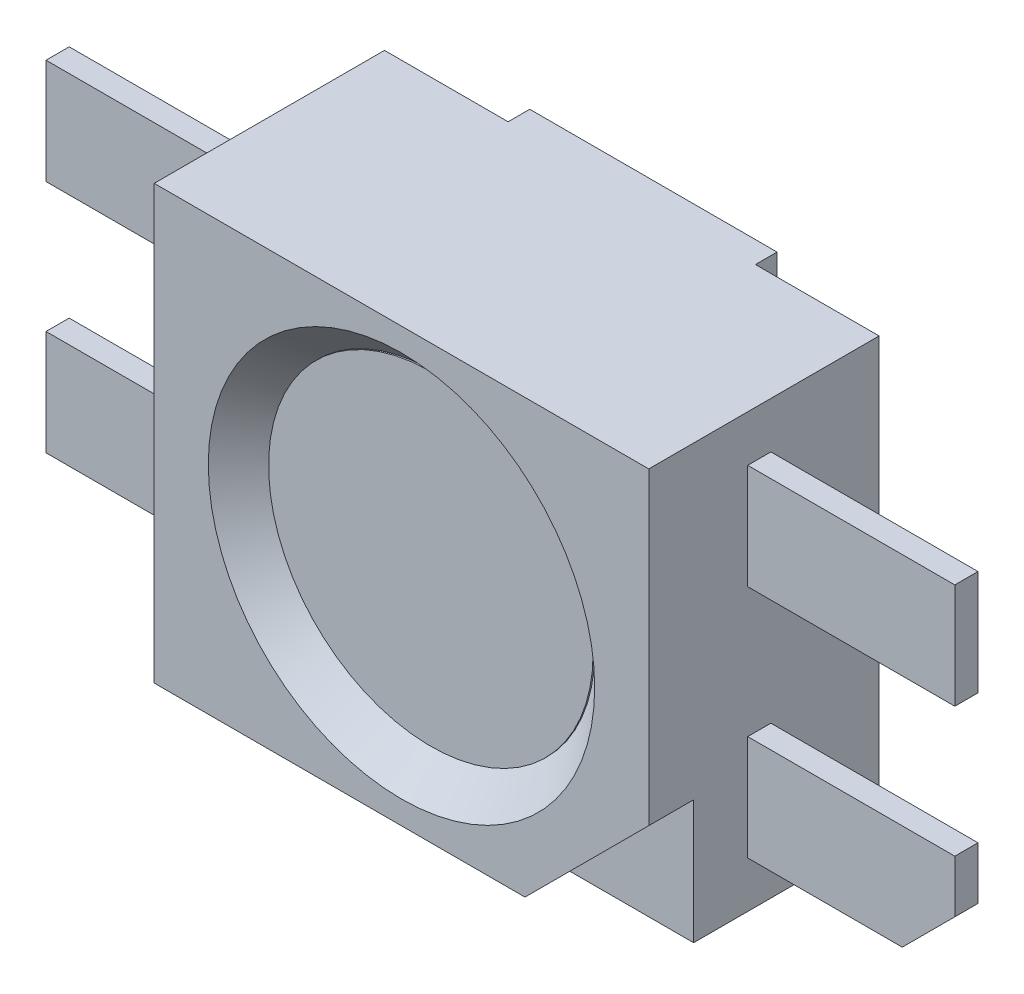
ISO-10303-21;
HEADER;
FILE_DESCRIPTION(('STEP AP214'),'2;1');
FILE_NAME('part.step','',(''),(''),'','','');
FILE_SCHEMA(('AUTOMOTIVE_DESIGN { 1 0 10303 214 1 1 1 1 }'));
ENDSEC;
DATA;
#1=APPLICATION_CONTEXT('core data for automotive mechanical design processes');
#2=APPLICATION_PROTOCOL_DEFINITION('international standard','automotive_design',2000,#1);
#3=PRODUCT_CONTEXT('',#1,'mechanical');
#4=PRODUCT('Part','Part','',(#3));
#5=PRODUCT_RELATED_PRODUCT_CATEGORY('part','',(#4));
#6=PRODUCT_DEFINITION_FORMATION('','',#4);
#7=PRODUCT_DEFINITION_CONTEXT('part definition',#1,'design');
#8=PRODUCT_DEFINITION('design','',#6,#7);
#9=PRODUCT_DEFINITION_SHAPE('','',#8);
#10=(LENGTH_UNIT() NAMED_UNIT(*) SI_UNIT(.MILLI.,.METRE.));
#11=(NAMED_UNIT(*) PLANE_ANGLE_UNIT() SI_UNIT($,.RADIAN.));
#12=(NAMED_UNIT(*) SI_UNIT($,.STERADIAN.) SOLID_ANGLE_UNIT());
#13=UNCERTAINTY_MEASURE_WITH_UNIT(LENGTH_MEASURE(1.E-05),#10,'distance_accuracy_value','');
#14=(GEOMETRIC_REPRESENTATION_CONTEXT(3) GLOBAL_UNCERTAINTY_ASSIGNED_CONTEXT((#13)) GLOBAL_UNIT_ASSIGNED_CONTEXT((#10,
#11,#12)) REPRESENTATION_CONTEXT('',''));
#15=CARTESIAN_POINT('',(0.,0.,0.));
#16=DIRECTION('',(0.,0.,1.));
#17=DIRECTION('',(1.,0.,0.));
#18=AXIS2_PLACEMENT_3D('',#15,#16,#17);
#19=CARTESIAN_POINT('',(-2.27,0.76,0.));
#20=DIRECTION('',(0.,0.,1.));
#21=DIRECTION('',(1.,0.,0.));
#22=AXIS2_PLACEMENT_3D('',#19,#20,#21);
#23=PLANE('',#22);
#24=DIRECTION('',(1.,0.,0.));
#25=VECTOR('',#24,1.);
#26=CARTESIAN_POINT('',(-2.94,0.42,0.));
#27=LINE('',#26,#25);
#28=CARTESIAN_POINT('',(-2.94,0.42,0.));
#29=VERTEX_POINT('',#28);
#30=CARTESIAN_POINT('',(-1.6,0.42,0.));
#31=VERTEX_POINT('',#30);
#32=EDGE_CURVE('P0_E79',#29,#31,#27,.T.);
#33=ORIENTED_EDGE('',*,*,#32,.F.);
#34=DIRECTION('',(0.,1.,0.));
#35=VECTOR('',#34,1.);
#36=CARTESIAN_POINT('',(-2.94,1.1,0.));
#37=LINE('',#36,#35);
#38=CARTESIAN_POINT('',(-2.94,1.1,0.));
#39=VERTEX_POINT('',#38);
#40=EDGE_CURVE('P0_E55',#39,#29,#37,.F.);
#41=ORIENTED_EDGE('',*,*,#40,.F.);
#42=DIRECTION('',(1.,0.,0.));
#43=VECTOR('',#42,1.);
#44=CARTESIAN_POINT('',(-1.6,1.1,0.));
#45=LINE('',#44,#43);
#46=CARTESIAN_POINT('',(-1.6,1.1,0.));
#47=VERTEX_POINT('',#46);
#48=EDGE_CURVE('P0_E57',#47,#39,#45,.F.);
#49=ORIENTED_EDGE('',*,*,#48,.F.);
#50=DIRECTION('',(0.,1.,0.));
#51=VECTOR('',#50,1.);
#52=CARTESIAN_POINT('',(-1.6,0.42,0.));
#53=LINE('',#52,#51);
#54=EDGE_CURVE('P0_E20',#31,#47,#53,.T.);
#55=ORIENTED_EDGE('',*,*,#54,.F.);
#56=EDGE_LOOP('',(#33,#41,#49,#55));
#57=FACE_BOUND('',#56,.T.);
#58=ADVANCED_FACE('P0_F17',(#57),#23,.F.);
#59=CARTESIAN_POINT('',(-1.6,0.42,0.));
#60=DIRECTION('',(1.,0.,0.));
#61=DIRECTION('',(0.,0.,-1.));
#62=AXIS2_PLACEMENT_3D('',#59,#60,#61);
#63=PLANE('',#62);
#64=DIRECTION('',(0.,1.,0.));
#65=VECTOR('',#64,1.);
#66=CARTESIAN_POINT('',(-1.6,0.76,0.15));
#67=LINE('',#66,#65);
#68=CARTESIAN_POINT('',(-1.6,0.42,0.15));
#69=VERTEX_POINT('',#68);
#70=CARTESIAN_POINT('',(-1.6,1.1,0.15));
#71=VERTEX_POINT('',#70);
#72=EDGE_CURVE('P0_E83',#69,#71,#67,.T.);
#73=ORIENTED_EDGE('',*,*,#72,.F.);
#74=DIRECTION('',(0.,0.,-1.));
#75=VECTOR('',#74,1.);
#76=CARTESIAN_POINT('',(-1.6,0.42,0.));
#77=LINE('',#76,#75);
#78=EDGE_CURVE('P0_E68',#31,#69,#77,.F.);
#79=ORIENTED_EDGE('',*,*,#78,.F.);
#80=ORIENTED_EDGE('',*,*,#54,.T.);
#81=DIRECTION('',(0.,0.,1.));
#82=VECTOR('',#81,1.);
#83=CARTESIAN_POINT('',(-1.6,1.1,0.));
#84=LINE('',#83,#82);
#85=EDGE_CURVE('P0_E63',#71,#47,#84,.F.);
#86=ORIENTED_EDGE('',*,*,#85,.F.);
#87=EDGE_LOOP('',(#73,#79,#80,#86));
#88=FACE_BOUND('',#87,.T.);
#89=ADVANCED_FACE('P0_F65',(#88),#63,.T.);
#90=CARTESIAN_POINT('',(-1.6,1.1,0.));
#91=DIRECTION('',(0.,1.,0.));
#92=DIRECTION('',(0.,0.,1.));
#93=AXIS2_PLACEMENT_3D('',#90,#91,#92);
#94=PLANE('',#93);
#95=DIRECTION('',(1.,0.,0.));
#96=VECTOR('',#95,1.);
#97=CARTESIAN_POINT('',(-2.27,1.1,0.15));
#98=LINE('',#97,#96);
#99=CARTESIAN_POINT('',(-2.94,1.1,0.15));
#100=VERTEX_POINT('',#99);
#101=EDGE_CURVE('P0_E72',#71,#100,#98,.F.);
#102=ORIENTED_EDGE('',*,*,#101,.F.);
#103=ORIENTED_EDGE('',*,*,#85,.T.);
#104=ORIENTED_EDGE('',*,*,#48,.T.);
#105=DIRECTION('',(0.,0.,1.));
#106=VECTOR('',#105,1.);
#107=CARTESIAN_POINT('',(-2.94,1.1,0.));
#108=LINE('',#107,#106);
#109=EDGE_CURVE('P0_E75',#100,#39,#108,.F.);
#110=ORIENTED_EDGE('',*,*,#109,.F.);
#111=EDGE_LOOP('',(#102,#103,#104,#110));
#112=FACE_BOUND('',#111,.T.);
#113=ADVANCED_FACE('P0_F70',(#112),#94,.T.);
#114=CARTESIAN_POINT('',(-2.94,1.1,0.));
#115=DIRECTION('',(-1.,0.,0.));
#116=DIRECTION('',(0.,0.,1.));
#117=AXIS2_PLACEMENT_3D('',#114,#115,#116);
#118=PLANE('',#117);
#119=DIRECTION('',(0.,1.,0.));
#120=VECTOR('',#119,1.);
#121=CARTESIAN_POINT('',(-2.94,0.76,0.15));
#122=LINE('',#121,#120);
#123=CARTESIAN_POINT('',(-2.94,0.42,0.15));
#124=VERTEX_POINT('',#123);
#125=EDGE_CURVE('P0_E26',#100,#124,#122,.F.);
#126=ORIENTED_EDGE('',*,*,#125,.F.);
#127=ORIENTED_EDGE('',*,*,#109,.T.);
#128=ORIENTED_EDGE('',*,*,#40,.T.);
#129=DIRECTION('',(0.,0.,-1.));
#130=VECTOR('',#129,1.);
#131=CARTESIAN_POINT('',(-2.94,0.42,0.));
#132=LINE('',#131,#130);
#133=EDGE_CURVE('P0_E35',#124,#29,#132,.T.);
#134=ORIENTED_EDGE('',*,*,#133,.F.);
#135=EDGE_LOOP('',(#126,#127,#128,#134));
#136=FACE_BOUND('',#135,.T.);
#137=ADVANCED_FACE('P0_F89',(#136),#118,.T.);
#138=CARTESIAN_POINT('',(-2.94,0.42,0.));
#139=DIRECTION('',(0.,-1.,0.));
#140=DIRECTION('',(0.,0.,-1.));
#141=AXIS2_PLACEMENT_3D('',#138,#139,#140);
#142=PLANE('',#141);
#143=DIRECTION('',(1.,0.,0.));
#144=VECTOR('',#143,1.);
#145=CARTESIAN_POINT('',(-2.27,0.42,0.15));
#146=LINE('',#145,#144);
#147=EDGE_CURVE('P0_E11',#124,#69,#146,.T.);
#148=ORIENTED_EDGE('',*,*,#147,.F.);
#149=ORIENTED_EDGE('',*,*,#133,.T.);
#150=ORIENTED_EDGE('',*,*,#32,.T.);
#151=ORIENTED_EDGE('',*,*,#78,.T.);
#152=EDGE_LOOP('',(#148,#149,#150,#151));
#153=FACE_BOUND('',#152,.T.);
#154=ADVANCED_FACE('P0_F91',(#153),#142,.T.);
#155=CARTESIAN_POINT('',(-2.27,0.76,0.15));
#156=DIRECTION('',(0.,0.,1.));
#157=DIRECTION('',(1.,0.,0.));
#158=AXIS2_PLACEMENT_3D('',#155,#156,#157);
#159=PLANE('',#158);
#160=ORIENTED_EDGE('',*,*,#125,.T.);
#161=ORIENTED_EDGE('',*,*,#147,.T.);
#162=ORIENTED_EDGE('',*,*,#72,.T.);
#163=ORIENTED_EDGE('',*,*,#101,.T.);
#164=EDGE_LOOP('',(#160,#161,#162,#163));
#165=FACE_BOUND('',#164,.T.);
#166=ADVANCED_FACE('P0_F88',(#165),#159,.T.);
#167=CLOSED_SHELL('',(#58,#89,#113,#137,#154,#166));
#168=MANIFOLD_SOLID_BREP('P0_B1',#167);
#169=CARTESIAN_POINT('',(-2.27,-0.76,0.));
#170=DIRECTION('',(0.,0.,1.));
#171=DIRECTION('',(1.,0.,0.));
#172=AXIS2_PLACEMENT_3D('',#169,#170,#171);
#173=PLANE('',#172);
#174=DIRECTION('',(1.,0.,0.));
#175=VECTOR('',#174,1.);
#176=CARTESIAN_POINT('',(-2.94,-1.1,0.));
#177=LINE('',#176,#175);
#178=CARTESIAN_POINT('',(-2.94,-1.1,0.));
#179=VERTEX_POINT('',#178);
#180=CARTESIAN_POINT('',(-1.6,-1.1,0.));
#181=VERTEX_POINT('',#180);
#182=EDGE_CURVE('P1_E79',#179,#181,#177,.T.);
#183=ORIENTED_EDGE('',*,*,#182,.F.);
#184=DIRECTION('',(0.,1.,0.));
#185=VECTOR('',#184,1.);
#186=CARTESIAN_POINT('',(-2.94,-0.42,0.));
#187=LINE('',#186,#185);
#188=CARTESIAN_POINT('',(-2.94,-0.42,0.));
#189=VERTEX_POINT('',#188);
#190=EDGE_CURVE('P1_E55',#189,#179,#187,.F.);
#191=ORIENTED_EDGE('',*,*,#190,.F.);
#192=DIRECTION('',(1.,0.,0.));
#193=VECTOR('',#192,1.);
#194=CARTESIAN_POINT('',(-1.6,-0.42,0.));
#195=LINE('',#194,#193);
#196=CARTESIAN_POINT('',(-1.6,-0.42,0.));
#197=VERTEX_POINT('',#196);
#198=EDGE_CURVE('P1_E57',#197,#189,#195,.F.);
#199=ORIENTED_EDGE('',*,*,#198,.F.);
#200=DIRECTION('',(0.,1.,0.));
#201=VECTOR('',#200,1.);
#202=CARTESIAN_POINT('',(-1.6,-1.1,0.));
#203=LINE('',#202,#201);
#204=EDGE_CURVE('P1_E20',#181,#197,#203,.T.);
#205=ORIENTED_EDGE('',*,*,#204,.F.);
#206=EDGE_LOOP('',(#183,#191,#199,#205));
#207=FACE_BOUND('',#206,.T.);
#208=ADVANCED_FACE('P1_F17',(#207),#173,.F.);
#209=CARTESIAN_POINT('',(-1.6,-1.1,0.));
#210=DIRECTION('',(1.,0.,0.));
#211=DIRECTION('',(0.,0.,-1.));
#212=AXIS2_PLACEMENT_3D('',#209,#210,#211);
#213=PLANE('',#212);
#214=DIRECTION('',(0.,1.,0.));
#215=VECTOR('',#214,1.);
#216=CARTESIAN_POINT('',(-1.6,-0.76,0.15));
#217=LINE('',#216,#215);
#218=CARTESIAN_POINT('',(-1.6,-1.1,0.15));
#219=VERTEX_POINT('',#218);
#220=CARTESIAN_POINT('',(-1.6,-0.42,0.15));
#221=VERTEX_POINT('',#220);
#222=EDGE_CURVE('P1_E83',#219,#221,#217,.T.);
#223=ORIENTED_EDGE('',*,*,#222,.F.);
#224=DIRECTION('',(0.,0.,-1.));
#225=VECTOR('',#224,1.);
#226=CARTESIAN_POINT('',(-1.6,-1.1,0.));
#227=LINE('',#226,#225);
#228=EDGE_CURVE('P1_E68',#181,#219,#227,.F.);
#229=ORIENTED_EDGE('',*,*,#228,.F.);
#230=ORIENTED_EDGE('',*,*,#204,.T.);
#231=DIRECTION('',(0.,0.,1.));
#232=VECTOR('',#231,1.);
#233=CARTESIAN_POINT('',(-1.6,-0.42,0.));
#234=LINE('',#233,#232);
#235=EDGE_CURVE('P1_E63',#221,#197,#234,.F.);
#236=ORIENTED_EDGE('',*,*,#235,.F.);
#237=EDGE_LOOP('',(#223,#229,#230,#236));
#238=FACE_BOUND('',#237,.T.);
#239=ADVANCED_FACE('P1_F65',(#238),#213,.T.);
#240=CARTESIAN_POINT('',(-1.6,-0.42,0.));
#241=DIRECTION('',(0.,1.,0.));
#242=DIRECTION('',(0.,0.,1.));
#243=AXIS2_PLACEMENT_3D('',#240,#241,#242);
#244=PLANE('',#243);
#245=DIRECTION('',(1.,0.,0.));
#246=VECTOR('',#245,1.);
#247=CARTESIAN_POINT('',(-2.27,-0.42,0.15));
#248=LINE('',#247,#246);
#249=CARTESIAN_POINT('',(-2.94,-0.42,0.15));
#250=VERTEX_POINT('',#249);
#251=EDGE_CURVE('P1_E72',#221,#250,#248,.F.);
#252=ORIENTED_EDGE('',*,*,#251,.F.);
#253=ORIENTED_EDGE('',*,*,#235,.T.);
#254=ORIENTED_EDGE('',*,*,#198,.T.);
#255=DIRECTION('',(0.,0.,1.));
#256=VECTOR('',#255,1.);
#257=CARTESIAN_POINT('',(-2.94,-0.42,0.));
#258=LINE('',#257,#256);
#259=EDGE_CURVE('P1_E75',#250,#189,#258,.F.);
#260=ORIENTED_EDGE('',*,*,#259,.F.);
#261=EDGE_LOOP('',(#252,#253,#254,#260));
#262=FACE_BOUND('',#261,.T.);
#263=ADVANCED_FACE('P1_F70',(#262),#244,.T.);
#264=CARTESIAN_POINT('',(-2.94,-0.42,0.));
#265=DIRECTION('',(-1.,0.,0.));
#266=DIRECTION('',(0.,0.,1.));
#267=AXIS2_PLACEMENT_3D('',#264,#265,#266);
#268=PLANE('',#267);
#269=DIRECTION('',(0.,1.,0.));
#270=VECTOR('',#269,1.);
#271=CARTESIAN_POINT('',(-2.94,-0.76,0.15));
#272=LINE('',#271,#270);
#273=CARTESIAN_POINT('',(-2.94,-1.1,0.15));
#274=VERTEX_POINT('',#273);
#275=EDGE_CURVE('P1_E26',#250,#274,#272,.F.);
#276=ORIENTED_EDGE('',*,*,#275,.F.);
#277=ORIENTED_EDGE('',*,*,#259,.T.);
#278=ORIENTED_EDGE('',*,*,#190,.T.);
#279=DIRECTION('',(0.,0.,-1.));
#280=VECTOR('',#279,1.);
#281=CARTESIAN_POINT('',(-2.94,-1.1,0.));
#282=LINE('',#281,#280);
#283=EDGE_CURVE('P1_E35',#274,#179,#282,.T.);
#284=ORIENTED_EDGE('',*,*,#283,.F.);
#285=EDGE_LOOP('',(#276,#277,#278,#284));
#286=FACE_BOUND('',#285,.T.);
#287=ADVANCED_FACE('P1_F89',(#286),#268,.T.);
#288=CARTESIAN_POINT('',(-2.94,-1.1,0.));
#289=DIRECTION('',(0.,-1.,0.));
#290=DIRECTION('',(0.,0.,-1.));
#291=AXIS2_PLACEMENT_3D('',#288,#289,#290);
#292=PLANE('',#291);
#293=DIRECTION('',(1.,0.,0.));
#294=VECTOR('',#293,1.);
#295=CARTESIAN_POINT('',(-2.27,-1.1,0.15));
#296=LINE('',#295,#294);
#297=EDGE_CURVE('P1_E11',#274,#219,#296,.T.);
#298=ORIENTED_EDGE('',*,*,#297,.F.);
#299=ORIENTED_EDGE('',*,*,#283,.T.);
#300=ORIENTED_EDGE('',*,*,#182,.T.);
#301=ORIENTED_EDGE('',*,*,#228,.T.);
#302=EDGE_LOOP('',(#298,#299,#300,#301));
#303=FACE_BOUND('',#302,.T.);
#304=ADVANCED_FACE('P1_F91',(#303),#292,.T.);
#305=CARTESIAN_POINT('',(-2.27,-0.76,0.15));
#306=DIRECTION('',(0.,0.,1.));
#307=DIRECTION('',(1.,0.,0.));
#308=AXIS2_PLACEMENT_3D('',#305,#306,#307);
#309=PLANE('',#308);
#310=ORIENTED_EDGE('',*,*,#275,.T.);
#311=ORIENTED_EDGE('',*,*,#297,.T.);
#312=ORIENTED_EDGE('',*,*,#222,.T.);
#313=ORIENTED_EDGE('',*,*,#251,.T.);
#314=EDGE_LOOP('',(#310,#311,#312,#313));
#315=FACE_BOUND('',#314,.T.);
#316=ADVANCED_FACE('P1_F88',(#315),#309,.T.);
#317=CLOSED_SHELL('',(#208,#239,#263,#287,#304,#316));
#318=MANIFOLD_SOLID_BREP('P1_B1',#317);
#319=CARTESIAN_POINT('',(0.,0.,-0.7));
#320=DIRECTION('',(0.,0.,1.));
#321=DIRECTION('',(1.,0.,0.));
#322=AXIS2_PLACEMENT_3D('',#319,#320,#321);
#323=PLANE('',#322);
#324=CARTESIAN_POINT('',(0.,0.,-0.7));
#325=DIRECTION('',(0.,0.,-1.));
#326=DIRECTION('',(-1.,0.,0.));
#327=AXIS2_PLACEMENT_3D('',#324,#325,#326);
#328=CIRCLE('',#327,0.625);
#329=CARTESIAN_POINT('',(-0.625,0.,-0.7));
#330=VERTEX_POINT('',#329);
#331=EDGE_CURVE('P2_E20',#330,#330,#328,.T.);
#332=ORIENTED_EDGE('',*,*,#331,.T.);
#333=EDGE_LOOP('',(#332));
#334=FACE_BOUND('',#333,.T.);
#335=ADVANCED_FACE('P2_F17',(#334),#323,.F.);
#336=CARTESIAN_POINT('',(0.,0.,-0.7));
#337=DIRECTION('',(0.,0.,-1.));
#338=DIRECTION('',(-1.,0.,0.));
#339=AXIS2_PLACEMENT_3D('',#336,#337,#338);
#340=CYLINDRICAL_SURFACE('',#339,0.625);
#341=CARTESIAN_POINT('',(0.,0.,-0.84));
#342=DIRECTION('',(0.,0.,-1.));
#343=DIRECTION('',(-1.,0.,0.));
#344=AXIS2_PLACEMENT_3D('',#341,#342,#343);
#345=CIRCLE('',#344,0.625);
#346=CARTESIAN_POINT('',(-0.625,0.,-0.84));
#347=VERTEX_POINT('',#346);
#348=EDGE_CURVE('P2_E107',#347,#347,#345,.F.);
#349=ORIENTED_EDGE('',*,*,#348,.F.);
#350=EDGE_LOOP('',(#349));
#351=FACE_BOUND('',#350,.T.);
#352=ORIENTED_EDGE('',*,*,#331,.F.);
#353=EDGE_LOOP('',(#352));
#354=FACE_BOUND('',#353,.T.);
#355=ADVANCED_FACE('P2_F346',(#351,#354),#340,.F.);
#356=CARTESIAN_POINT('',(0.,0.,-0.84));
#357=DIRECTION('',(0.,0.,-1.));
#358=DIRECTION('',(-1.,0.,0.));
#359=AXIS2_PLACEMENT_3D('',#356,#357,#358);
#360=PLANE('',#359);
#361=ORIENTED_EDGE('',*,*,#348,.T.);
#362=EDGE_LOOP('',(#361));
#363=FACE_BOUND('',#362,.T.);
#364=DIRECTION('',(-0.00039384918611296,-0.999999922441406,0.));
#365=VECTOR('',#364,1.);
#366=CARTESIAN_POINT('',(0.798897222193,-1.4,-0.84));
#367=LINE('',#366,#365);
#368=CARTESIAN_POINT('',(0.799999999999912,1.4,-0.84));
#369=VERTEX_POINT('',#368);
#370=CARTESIAN_POINT('',(0.798897222193,-1.4,-0.84));
#371=VERTEX_POINT('',#370);
#372=EDGE_CURVE('P2_E111',#369,#371,#367,.T.);
#373=ORIENTED_EDGE('',*,*,#372,.T.);
#374=DIRECTION('',(-1.,0.,0.));
#375=VECTOR('',#374,1.);
#376=CARTESIAN_POINT('',(0.,-1.4,-0.84));
#377=LINE('',#376,#375);
#378=CARTESIAN_POINT('',(-0.8,-1.4,-0.84));
#379=VERTEX_POINT('',#378);
#380=EDGE_CURVE('P2_E96',#371,#379,#377,.T.);
#381=ORIENTED_EDGE('',*,*,#380,.T.);
#382=DIRECTION('',(0.,1.,0.));
#383=VECTOR('',#382,1.);
#384=CARTESIAN_POINT('',(-0.8,1.4,-0.84));
#385=LINE('',#384,#383);
#386=CARTESIAN_POINT('',(-0.8,1.4,-0.84));
#387=VERTEX_POINT('',#386);
#388=EDGE_CURVE('P2_E152',#379,#387,#385,.T.);
#389=ORIENTED_EDGE('',*,*,#388,.T.);
#390=DIRECTION('',(-1.,0.,0.));
#391=VECTOR('',#390,1.);
#392=CARTESIAN_POINT('',(0.,1.4,-0.84));
#393=LINE('',#392,#391);
#394=EDGE_CURVE('P2_E108',#387,#369,#393,.F.);
#395=ORIENTED_EDGE('',*,*,#394,.T.);
#396=EDGE_LOOP('',(#373,#381,#389,#395));
#397=FACE_BOUND('',#396,.T.);
#398=ADVANCED_FACE('P2_F112',(#363,#397),#360,.T.);
#399=CARTESIAN_POINT('',(0.798897222193,-1.4,-0.7));
#400=DIRECTION('',(-0.999999922441406,0.00039384918611296,0.));
#401=DIRECTION('',(-0.00039384918611296,-0.999999922441406,0.));
#402=AXIS2_PLACEMENT_3D('',#399,#400,#401);
#403=PLANE('',#402);
#404=DIRECTION('',(0.,0.,1.));
#405=VECTOR('',#404,1.);
#406=CARTESIAN_POINT('',(0.799999999999646,1.4,-0.7));
#407=LINE('',#406,#405);
#408=CARTESIAN_POINT('',(0.799999999999823,1.4,-0.7));
#409=VERTEX_POINT('',#408);
#410=EDGE_CURVE('P2_E91',#409,#369,#407,.F.);
#411=ORIENTED_EDGE('',*,*,#410,.F.);
#412=DIRECTION('',(-0.000393849186239329,-0.999999922441406,0.));
#413=VECTOR('',#412,1.);
#414=CARTESIAN_POINT('',(0.8,1.4,-0.7));
#415=LINE('',#414,#413);
#416=CARTESIAN_POINT('',(0.798897222193,-1.4,-0.7));
#417=VERTEX_POINT('',#416);
#418=EDGE_CURVE('P2_E118',#409,#417,#415,.T.);
#419=ORIENTED_EDGE('',*,*,#418,.T.);
#420=DIRECTION('',(0.,0.,1.));
#421=VECTOR('',#420,1.);
#422=CARTESIAN_POINT('',(0.798897222193,-1.4,-0.7));
#423=LINE('',#422,#421);
#424=EDGE_CURVE('P2_E100',#371,#417,#423,.T.);
#425=ORIENTED_EDGE('',*,*,#424,.F.);
#426=ORIENTED_EDGE('',*,*,#372,.F.);
#427=EDGE_LOOP('',(#411,#419,#425,#426));
#428=FACE_BOUND('',#427,.T.);
#429=ADVANCED_FACE('P2_F116',(#428),#403,.F.);
#430=CARTESIAN_POINT('',(-0.8,1.4,-0.7));
#431=DIRECTION('',(1.,0.,0.));
#432=DIRECTION('',(0.,0.,-1.));
#433=AXIS2_PLACEMENT_3D('',#430,#431,#432);
#434=PLANE('',#433);
#435=DIRECTION('',(0.,0.,-1.));
#436=VECTOR('',#435,1.);
#437=CARTESIAN_POINT('',(-0.8,-1.4,-0.7));
#438=LINE('',#437,#436);
#439=CARTESIAN_POINT('',(-0.8,-1.4,-0.7));
#440=VERTEX_POINT('',#439);
#441=EDGE_CURVE('P2_E103',#440,#379,#438,.T.);
#442=ORIENTED_EDGE('',*,*,#441,.F.);
#443=DIRECTION('',(0.,1.,0.));
#444=VECTOR('',#443,1.);
#445=CARTESIAN_POINT('',(-0.8,0.,-0.7));
#446=LINE('',#445,#444);
#447=CARTESIAN_POINT('',(-0.8,1.4,-0.7));
#448=VERTEX_POINT('',#447);
#449=EDGE_CURVE('P2_E136',#440,#448,#446,.T.);
#450=ORIENTED_EDGE('',*,*,#449,.T.);
#451=DIRECTION('',(0.,0.,-1.));
#452=VECTOR('',#451,1.);
#453=CARTESIAN_POINT('',(-0.8,1.4,-0.7));
#454=LINE('',#453,#452);
#455=EDGE_CURVE('P2_E114',#387,#448,#454,.F.);
#456=ORIENTED_EDGE('',*,*,#455,.F.);
#457=ORIENTED_EDGE('',*,*,#388,.F.);
#458=EDGE_LOOP('',(#442,#450,#456,#457));
#459=FACE_BOUND('',#458,.T.);
#460=ADVANCED_FACE('P2_F159',(#459),#434,.F.);
#461=CARTESIAN_POINT('',(0.,0.,0.5));
#462=DIRECTION('',(0.,0.,1.));
#463=DIRECTION('',(1.,0.,0.));
#464=AXIS2_PLACEMENT_3D('',#461,#462,#463);
#465=PLANE('',#464);
#466=CARTESIAN_POINT('',(0.,0.,0.5));
#467=DIRECTION('',(0.,0.,1.));
#468=DIRECTION('',(1.,0.,0.));
#469=AXIS2_PLACEMENT_3D('',#466,#467,#468);
#470=CIRCLE('',#469,1.05);
#471=CARTESIAN_POINT('',(1.05,0.,0.5));
#472=VERTEX_POINT('',#471);
#473=EDGE_CURVE('P2_E128',#472,#472,#470,.T.);
#474=ORIENTED_EDGE('',*,*,#473,.T.);
#475=EDGE_LOOP('',(#474));
#476=FACE_BOUND('',#475,.T.);
#477=ADVANCED_FACE('P2_F218',(#476),#465,.T.);
#478=CARTESIAN_POINT('',(1.199448611097,0.,-0.7));
#479=DIRECTION('',(0.,0.,1.));
#480=DIRECTION('',(1.,0.,0.));
#481=AXIS2_PLACEMENT_3D('',#478,#479,#480);
#482=PLANE('',#481);
#483=DIRECTION('',(0.,1.,0.));
#484=VECTOR('',#483,1.);
#485=CARTESIAN_POINT('',(1.6,1.4,-0.7));
#486=LINE('',#485,#484);
#487=CARTESIAN_POINT('',(1.6,-1.4,-0.7));
#488=VERTEX_POINT('',#487);
#489=CARTESIAN_POINT('',(1.6,1.4,-0.7));
#490=VERTEX_POINT('',#489);
#491=EDGE_CURVE('P2_E182',#488,#490,#486,.T.);
#492=ORIENTED_EDGE('',*,*,#491,.F.);
#493=DIRECTION('',(1.,0.,0.));
#494=VECTOR('',#493,1.);
#495=CARTESIAN_POINT('',(1.199448611097,-1.4,-0.7));
#496=LINE('',#495,#494);
#497=EDGE_CURVE('P2_E149',#417,#488,#496,.T.);
#498=ORIENTED_EDGE('',*,*,#497,.F.);
#499=ORIENTED_EDGE('',*,*,#418,.F.);
#500=DIRECTION('',(1.,0.,0.));
#501=VECTOR('',#500,1.);
#502=CARTESIAN_POINT('',(1.199448611097,1.4,-0.7));
#503=LINE('',#502,#501);
#504=EDGE_CURVE('P2_E147',#490,#409,#503,.F.);
#505=ORIENTED_EDGE('',*,*,#504,.F.);
#506=EDGE_LOOP('',(#492,#498,#499,#505));
#507=FACE_BOUND('',#506,.T.);
#508=ADVANCED_FACE('P2_F216',(#507),#482,.F.);
#509=CARTESIAN_POINT('',(-1.2,0.,-0.7));
#510=DIRECTION('',(0.,0.,1.));
#511=DIRECTION('',(1.,0.,0.));
#512=AXIS2_PLACEMENT_3D('',#509,#510,#511);
#513=PLANE('',#512);
#514=ORIENTED_EDGE('',*,*,#449,.F.);
#515=DIRECTION('',(1.,0.,0.));
#516=VECTOR('',#515,1.);
#517=CARTESIAN_POINT('',(-1.2,-1.4,-0.7));
#518=LINE('',#517,#516);
#519=CARTESIAN_POINT('',(-1.6,-1.4,-0.7));
#520=VERTEX_POINT('',#519);
#521=EDGE_CURVE('P2_E141',#520,#440,#518,.T.);
#522=ORIENTED_EDGE('',*,*,#521,.F.);
#523=DIRECTION('',(0.,1.,0.));
#524=VECTOR('',#523,1.);
#525=CARTESIAN_POINT('',(-1.6,-1.4,-0.7));
#526=LINE('',#525,#524);
#527=CARTESIAN_POINT('',(-1.6,1.4,-0.7));
#528=VERTEX_POINT('',#527);
#529=EDGE_CURVE('P2_E163',#528,#520,#526,.F.);
#530=ORIENTED_EDGE('',*,*,#529,.F.);
#531=DIRECTION('',(1.,0.,0.));
#532=VECTOR('',#531,1.);
#533=CARTESIAN_POINT('',(-1.2,1.4,-0.7));
#534=LINE('',#533,#532);
#535=EDGE_CURVE('P2_E131',#448,#528,#534,.F.);
#536=ORIENTED_EDGE('',*,*,#535,.F.);
#537=EDGE_LOOP('',(#514,#522,#530,#536));
#538=FACE_BOUND('',#537,.T.);
#539=ADVANCED_FACE('P2_F161',(#538),#513,.F.);
#540=CARTESIAN_POINT('',(1.199448611097,-0.999448611097,0.5));
#541=DIRECTION('',(0.,0.,1.));
#542=DIRECTION('',(1.,0.,0.));
#543=AXIS2_PLACEMENT_3D('',#540,#541,#542);
#544=PLANE('',#543);
#545=DIRECTION('',(-0.707106781186548,-0.707106781186548,0.));
#546=VECTOR('',#545,1.);
#547=CARTESIAN_POINT('',(1.6,-0.598897222193,0.5));
#548=LINE('',#547,#546);
#549=CARTESIAN_POINT('',(1.6,-0.598897222193,0.5));
#550=VERTEX_POINT('',#549);
#551=CARTESIAN_POINT('',(0.798897222193,-1.4,0.5));
#552=VERTEX_POINT('',#551);
#553=EDGE_CURVE('P2_E130',#550,#552,#548,.T.);
#554=ORIENTED_EDGE('',*,*,#553,.T.);
#555=DIRECTION('',(1.,0.,0.));
#556=VECTOR('',#555,1.);
#557=CARTESIAN_POINT('',(1.6,-1.4,0.5));
#558=LINE('',#557,#556);
#559=CARTESIAN_POINT('',(1.6,-1.4,0.5));
#560=VERTEX_POINT('',#559);
#561=EDGE_CURVE('P2_E174',#560,#552,#558,.F.);
#562=ORIENTED_EDGE('',*,*,#561,.F.);
#563=DIRECTION('',(0.,1.,0.));
#564=VECTOR('',#563,1.);
#565=CARTESIAN_POINT('',(1.6,1.4,0.5));
#566=LINE('',#565,#564);
#567=EDGE_CURVE('P2_E184',#550,#560,#566,.F.);
#568=ORIENTED_EDGE('',*,*,#567,.F.);
#569=EDGE_LOOP('',(#554,#562,#568));
#570=FACE_BOUND('',#569,.T.);
#571=ADVANCED_FACE('P2_F200',(#570),#544,.T.);
#572=CARTESIAN_POINT('',(0.,0.,0.5));
#573=DIRECTION('',(0.,0.,1.));
#574=DIRECTION('',(1.,0.,0.));
#575=AXIS2_PLACEMENT_3D('',#572,#573,#574);
#576=CYLINDRICAL_SURFACE('',#575,1.05);
#577=CARTESIAN_POINT('',(0.,0.,0.589999999931479));
#578=DIRECTION('',(0.,0.,1.));
#579=DIRECTION('',(1.,0.,0.));
#580=AXIS2_PLACEMENT_3D('',#577,#578,#579);
#581=CIRCLE('',#580,1.0499999999638);
#582=CARTESIAN_POINT('',(1.0499999999638,0.,0.589999999931479));
#583=VERTEX_POINT('',#582);
#584=EDGE_CURVE('P2_E144',#583,#583,#581,.T.);
#585=ORIENTED_EDGE('',*,*,#584,.T.);
#586=EDGE_LOOP('',(#585));
#587=FACE_BOUND('',#586,.T.);
#588=ORIENTED_EDGE('',*,*,#473,.F.);
#589=EDGE_LOOP('',(#588));
#590=FACE_BOUND('',#589,.T.);
#591=ADVANCED_FACE('P2_F247',(#587,#590),#576,.F.);
#592=CARTESIAN_POINT('',(1.6,-0.598897222193,0.5));
#593=DIRECTION('',(-0.707106781186548,0.707106781186548,0.));
#594=DIRECTION('',(-0.707106781186548,-0.707106781186548,0.));
#595=AXIS2_PLACEMENT_3D('',#592,#593,#594);
#596=PLANE('',#595);
#597=DIRECTION('',(0.,0.,-1.));
#598=VECTOR('',#597,1.);
#599=CARTESIAN_POINT('',(0.798897222193,-1.4,0.));
#600=LINE('',#599,#598);
#601=CARTESIAN_POINT('',(0.798897222193,-1.4,0.79));
#602=VERTEX_POINT('',#601);
#603=EDGE_CURVE('P2_E177',#552,#602,#600,.F.);
#604=ORIENTED_EDGE('',*,*,#603,.F.);
#605=ORIENTED_EDGE('',*,*,#553,.F.);
#606=DIRECTION('',(0.,0.,-1.));
#607=VECTOR('',#606,1.);
#608=CARTESIAN_POINT('',(1.6,-0.598897222193,0.));
#609=LINE('',#608,#607);
#610=CARTESIAN_POINT('',(1.6,-0.598897222193,0.79));
#611=VERTEX_POINT('',#610);
#612=EDGE_CURVE('P2_E134',#611,#550,#609,.T.);
#613=ORIENTED_EDGE('',*,*,#612,.F.);
#614=DIRECTION('',(0.707106781186548,0.707106781186547,0.));
#615=VECTOR('',#614,1.);
#616=CARTESIAN_POINT('',(0.798897222193,-1.4,0.79));
#617=LINE('',#616,#615);
#618=EDGE_CURVE('P2_E197',#602,#611,#617,.T.);
#619=ORIENTED_EDGE('',*,*,#618,.F.);
#620=EDGE_LOOP('',(#604,#605,#613,#619));
#621=FACE_BOUND('',#620,.T.);
#622=ADVANCED_FACE('P2_F196',(#621),#596,.F.);
#623=CARTESIAN_POINT('',(1.6,1.4,0.));
#624=DIRECTION('',(1.,0.,0.));
#625=DIRECTION('',(0.,0.,-1.));
#626=AXIS2_PLACEMENT_3D('',#623,#624,#625);
#627=PLANE('',#626);
#628=DIRECTION('',(0.,0.,-1.));
#629=VECTOR('',#628,1.);
#630=CARTESIAN_POINT('',(1.6,1.4,0.));
#631=LINE('',#630,#629);
#632=CARTESIAN_POINT('',(1.6,1.4,0.79));
#633=VERTEX_POINT('',#632);
#634=EDGE_CURVE('P2_E35',#490,#633,#631,.F.);
#635=ORIENTED_EDGE('',*,*,#634,.T.);
#636=DIRECTION('',(0.,1.,0.));
#637=VECTOR('',#636,1.);
#638=CARTESIAN_POINT('',(1.6,0.,0.79));
#639=LINE('',#638,#637);
#640=EDGE_CURVE('P2_E192',#611,#633,#639,.T.);
#641=ORIENTED_EDGE('',*,*,#640,.F.);
#642=ORIENTED_EDGE('',*,*,#612,.T.);
#643=ORIENTED_EDGE('',*,*,#567,.T.);
#644=DIRECTION('',(0.,0.,-1.));
#645=VECTOR('',#644,1.);
#646=CARTESIAN_POINT('',(1.6,-1.4,0.));
#647=LINE('',#646,#645);
#648=EDGE_CURVE('P2_E203',#488,#560,#647,.F.);
#649=ORIENTED_EDGE('',*,*,#648,.F.);
#650=ORIENTED_EDGE('',*,*,#491,.T.);
#651=EDGE_LOOP('',(#635,#641,#642,#643,#649,#650));
#652=FACE_BOUND('',#651,.T.);
#653=ADVANCED_FACE('P2_F188',(#652),#627,.T.);
#654=CARTESIAN_POINT('',(-1.6,-1.4,0.));
#655=DIRECTION('',(-1.,0.,0.));
#656=DIRECTION('',(0.,0.,1.));
#657=AXIS2_PLACEMENT_3D('',#654,#655,#656);
#658=PLANE('',#657);
#659=DIRECTION('',(0.,1.,0.));
#660=VECTOR('',#659,1.);
#661=CARTESIAN_POINT('',(-1.6,0.,0.79));
#662=LINE('',#661,#660);
#663=CARTESIAN_POINT('',(-1.6,1.4,0.79));
#664=VERTEX_POINT('',#663);
#665=CARTESIAN_POINT('',(-1.6,-1.4,0.79));
#666=VERTEX_POINT('',#665);
#667=EDGE_CURVE('P2_E172',#664,#666,#662,.F.);
#668=ORIENTED_EDGE('',*,*,#667,.F.);
#669=DIRECTION('',(0.,0.,1.));
#670=VECTOR('',#669,1.);
#671=CARTESIAN_POINT('',(-1.6,1.4,0.));
#672=LINE('',#671,#670);
#673=EDGE_CURVE('P2_E167',#664,#528,#672,.F.);
#674=ORIENTED_EDGE('',*,*,#673,.T.);
#675=ORIENTED_EDGE('',*,*,#529,.T.);
#676=DIRECTION('',(0.,0.,-1.));
#677=VECTOR('',#676,1.);
#678=CARTESIAN_POINT('',(-1.6,-1.4,0.));
#679=LINE('',#678,#677);
#680=EDGE_CURVE('P2_E205',#666,#520,#679,.T.);
#681=ORIENTED_EDGE('',*,*,#680,.F.);
#682=EDGE_LOOP('',(#668,#674,#675,#681));
#683=FACE_BOUND('',#682,.T.);
#684=ADVANCED_FACE('P2_F170',(#683),#658,.T.);
#685=CARTESIAN_POINT('',(1.6,-1.4,0.));
#686=DIRECTION('',(0.,-1.,0.));
#687=DIRECTION('',(0.,0.,-1.));
#688=AXIS2_PLACEMENT_3D('',#685,#686,#687);
#689=PLANE('',#688);
#690=ORIENTED_EDGE('',*,*,#497,.T.);
#691=ORIENTED_EDGE('',*,*,#648,.T.);
#692=ORIENTED_EDGE('',*,*,#561,.T.);
#693=ORIENTED_EDGE('',*,*,#603,.T.);
#694=DIRECTION('',(1.,0.,0.));
#695=VECTOR('',#694,1.);
#696=CARTESIAN_POINT('',(0.,-1.4,0.79));
#697=LINE('',#696,#695);
#698=EDGE_CURVE('P2_E127',#666,#602,#697,.T.);
#699=ORIENTED_EDGE('',*,*,#698,.F.);
#700=ORIENTED_EDGE('',*,*,#680,.T.);
#701=ORIENTED_EDGE('',*,*,#521,.T.);
#702=ORIENTED_EDGE('',*,*,#441,.T.);
#703=ORIENTED_EDGE('',*,*,#380,.F.);
#704=ORIENTED_EDGE('',*,*,#424,.T.);
#705=EDGE_LOOP('',(#690,#691,#692,#693,#699,#700,#701,#702,#703,#704));
#706=FACE_BOUND('',#705,.T.);
#707=ADVANCED_FACE('P2_F98',(#706),#689,.T.);
#708=CARTESIAN_POINT('',(0.,0.,0.789999999881275));
#709=DIRECTION('',(0.,0.,1.));
#710=DIRECTION('',(1.,0.,0.));
#711=AXIS2_PLACEMENT_3D('',#708,#709,#710);
#712=CONICAL_SURFACE('',#711,1.2499999999136,0.785398163397448);
#713=ORIENTED_EDGE('',*,*,#584,.F.);
#714=EDGE_LOOP('',(#713));
#715=FACE_BOUND('',#714,.T.);
#716=CARTESIAN_POINT('',(0.,0.,0.789999999994961));
#717=DIRECTION('',(0.,0.,1.));
#718=DIRECTION('',(1.,0.,0.));
#719=AXIS2_PLACEMENT_3D('',#716,#717,#718);
#720=CIRCLE('',#719,1.25000000002728);
#721=CARTESIAN_POINT('',(1.25000000002728,0.,0.789999999994961));
#722=VERTEX_POINT('',#721);
#723=EDGE_CURVE('P2_E26',#722,#722,#720,.F.);
#724=ORIENTED_EDGE('',*,*,#723,.F.);
#725=EDGE_LOOP('',(#724));
#726=FACE_BOUND('',#725,.T.);
#727=ADVANCED_FACE('P2_F232',(#715,#726),#712,.F.);
#728=CARTESIAN_POINT('',(0.,0.,0.79));
#729=DIRECTION('',(0.,0.,1.));
#730=DIRECTION('',(1.,0.,0.));
#731=AXIS2_PLACEMENT_3D('',#728,#729,#730);
#732=PLANE('',#731);
#733=ORIENTED_EDGE('',*,*,#723,.T.);
#734=EDGE_LOOP('',(#733));
#735=FACE_BOUND('',#734,.T.);
#736=ORIENTED_EDGE('',*,*,#667,.T.);
#737=ORIENTED_EDGE('',*,*,#698,.T.);
#738=ORIENTED_EDGE('',*,*,#618,.T.);
#739=ORIENTED_EDGE('',*,*,#640,.T.);
#740=DIRECTION('',(1.,0.,0.));
#741=VECTOR('',#740,1.);
#742=CARTESIAN_POINT('',(-1.6,1.4,0.79));
#743=LINE('',#742,#741);
#744=EDGE_CURVE('P2_E11',#664,#633,#743,.T.);
#745=ORIENTED_EDGE('',*,*,#744,.F.);
#746=EDGE_LOOP('',(#736,#737,#738,#739,#745));
#747=FACE_BOUND('',#746,.T.);
#748=ADVANCED_FACE('P2_F214',(#735,#747),#732,.T.);
#749=CARTESIAN_POINT('',(-1.6,1.4,0.));
#750=DIRECTION('',(0.,1.,0.));
#751=DIRECTION('',(0.,0.,1.));
#752=AXIS2_PLACEMENT_3D('',#749,#750,#751);
#753=PLANE('',#752);
#754=ORIENTED_EDGE('',*,*,#394,.F.);
#755=ORIENTED_EDGE('',*,*,#455,.T.);
#756=ORIENTED_EDGE('',*,*,#535,.T.);
#757=ORIENTED_EDGE('',*,*,#673,.F.);
#758=ORIENTED_EDGE('',*,*,#744,.T.);
#759=ORIENTED_EDGE('',*,*,#634,.F.);
#760=ORIENTED_EDGE('',*,*,#504,.T.);
#761=ORIENTED_EDGE('',*,*,#410,.T.);
#762=EDGE_LOOP('',(#754,#755,#756,#757,#758,#759,#760,#761));
#763=FACE_BOUND('',#762,.T.);
#764=ADVANCED_FACE('P2_F156',(#763),#753,.T.);
#765=CLOSED_SHELL('',(#335,#355,#398,#429,#460,#477,#508,#539,#571,#591,#622,#653,#684,#707,
#727,#748,#764));
#766=MANIFOLD_SOLID_BREP('P2_B1',#765);
#767=CARTESIAN_POINT('',(0.,0.,0.5));
#768=DIRECTION('',(0.,0.,1.));
#769=DIRECTION('',(1.,0.,0.));
#770=AXIS2_PLACEMENT_3D('',#767,#768,#769);
#771=PLANE('',#770);
#772=CARTESIAN_POINT('',(0.,0.,0.5));
#773=DIRECTION('',(0.,0.,1.));
#774=DIRECTION('',(1.,0.,0.));
#775=AXIS2_PLACEMENT_3D('',#772,#773,#774);
#776=CIRCLE('',#775,1.05);
#777=CARTESIAN_POINT('',(1.05,0.,0.5));
#778=VERTEX_POINT('',#777);
#779=EDGE_CURVE('P3_E18',#778,#778,#776,.T.);
#780=ORIENTED_EDGE('',*,*,#779,.F.);
#781=EDGE_LOOP('',(#780));
#782=FACE_BOUND('',#781,.T.);
#783=ADVANCED_FACE('P3_F15',(#782),#771,.F.);
#784=CARTESIAN_POINT('',(0.,0.,0.5));
#785=DIRECTION('',(0.,0.,1.));
#786=DIRECTION('',(1.,0.,0.));
#787=AXIS2_PLACEMENT_3D('',#784,#785,#786);
#788=CYLINDRICAL_SURFACE('',#787,1.05);
#789=ORIENTED_EDGE('',*,*,#779,.T.);
#790=EDGE_LOOP('',(#789));
#791=FACE_BOUND('',#790,.T.);
#792=CARTESIAN_POINT('',(0.,0.,0.6));
#793=DIRECTION('',(0.,0.,1.));
#794=DIRECTION('',(1.,0.,0.));
#795=AXIS2_PLACEMENT_3D('',#792,#793,#794);
#796=CIRCLE('',#795,1.05);
#797=CARTESIAN_POINT('',(1.05,0.,0.6));
#798=VERTEX_POINT('',#797);
#799=EDGE_CURVE('P3_E10',#798,#798,#796,.T.);
#800=ORIENTED_EDGE('',*,*,#799,.F.);
#801=EDGE_LOOP('',(#800));
#802=FACE_BOUND('',#801,.T.);
#803=ADVANCED_FACE('P3_F27',(#791,#802),#788,.T.);
#804=CARTESIAN_POINT('',(0.,0.,0.6));
#805=DIRECTION('',(0.,0.,1.));
#806=DIRECTION('',(1.,0.,0.));
#807=AXIS2_PLACEMENT_3D('',#804,#805,#806);
#808=PLANE('',#807);
#809=ORIENTED_EDGE('',*,*,#799,.T.);
#810=EDGE_LOOP('',(#809));
#811=FACE_BOUND('',#810,.T.);
#812=ADVANCED_FACE('P3_F35',(#811),#808,.T.);
#813=CLOSED_SHELL('',(#783,#803,#812));
#814=MANIFOLD_SOLID_BREP('P3_B1',#813);
#815=CARTESIAN_POINT('',(2.27,0.76,0.));
#816=DIRECTION('',(0.,0.,1.));
#817=DIRECTION('',(1.,0.,0.));
#818=AXIS2_PLACEMENT_3D('',#815,#816,#817);
#819=PLANE('',#818);
#820=DIRECTION('',(1.,0.,0.));
#821=VECTOR('',#820,1.);
#822=CARTESIAN_POINT('',(1.6,0.42,0.));
#823=LINE('',#822,#821);
#824=CARTESIAN_POINT('',(1.6,0.42,0.));
#825=VERTEX_POINT('',#824);
#826=CARTESIAN_POINT('',(2.94,0.42,0.));
#827=VERTEX_POINT('',#826);
#828=EDGE_CURVE('P4_E79',#825,#827,#823,.T.);
#829=ORIENTED_EDGE('',*,*,#828,.F.);
#830=DIRECTION('',(0.,1.,0.));
#831=VECTOR('',#830,1.);
#832=CARTESIAN_POINT('',(1.6,1.1,0.));
#833=LINE('',#832,#831);
#834=CARTESIAN_POINT('',(1.6,1.1,0.));
#835=VERTEX_POINT('',#834);
#836=EDGE_CURVE('P4_E55',#835,#825,#833,.F.);
#837=ORIENTED_EDGE('',*,*,#836,.F.);
#838=DIRECTION('',(1.,0.,0.));
#839=VECTOR('',#838,1.);
#840=CARTESIAN_POINT('',(2.94,1.1,0.));
#841=LINE('',#840,#839);
#842=CARTESIAN_POINT('',(2.94,1.1,0.));
#843=VERTEX_POINT('',#842);
#844=EDGE_CURVE('P4_E57',#843,#835,#841,.F.);
#845=ORIENTED_EDGE('',*,*,#844,.F.);
#846=DIRECTION('',(0.,1.,0.));
#847=VECTOR('',#846,1.);
#848=CARTESIAN_POINT('',(2.94,0.42,0.));
#849=LINE('',#848,#847);
#850=EDGE_CURVE('P4_E20',#827,#843,#849,.T.);
#851=ORIENTED_EDGE('',*,*,#850,.F.);
#852=EDGE_LOOP('',(#829,#837,#845,#851));
#853=FACE_BOUND('',#852,.T.);
#854=ADVANCED_FACE('P4_F17',(#853),#819,.F.);
#855=CARTESIAN_POINT('',(2.94,0.42,0.));
#856=DIRECTION('',(1.,0.,0.));
#857=DIRECTION('',(0.,0.,-1.));
#858=AXIS2_PLACEMENT_3D('',#855,#856,#857);
#859=PLANE('',#858);
#860=DIRECTION('',(0.,1.,0.));
#861=VECTOR('',#860,1.);
#862=CARTESIAN_POINT('',(2.94,0.76,0.15));
#863=LINE('',#862,#861);
#864=CARTESIAN_POINT('',(2.94,0.42,0.15));
#865=VERTEX_POINT('',#864);
#866=CARTESIAN_POINT('',(2.94,1.1,0.15));
#867=VERTEX_POINT('',#866);
#868=EDGE_CURVE('P4_E83',#865,#867,#863,.T.);
#869=ORIENTED_EDGE('',*,*,#868,.F.);
#870=DIRECTION('',(0.,0.,-1.));
#871=VECTOR('',#870,1.);
#872=CARTESIAN_POINT('',(2.94,0.42,0.));
#873=LINE('',#872,#871);
#874=EDGE_CURVE('P4_E68',#827,#865,#873,.F.);
#875=ORIENTED_EDGE('',*,*,#874,.F.);
#876=ORIENTED_EDGE('',*,*,#850,.T.);
#877=DIRECTION('',(0.,0.,1.));
#878=VECTOR('',#877,1.);
#879=CARTESIAN_POINT('',(2.94,1.1,0.));
#880=LINE('',#879,#878);
#881=EDGE_CURVE('P4_E63',#867,#843,#880,.F.);
#882=ORIENTED_EDGE('',*,*,#881,.F.);
#883=EDGE_LOOP('',(#869,#875,#876,#882));
#884=FACE_BOUND('',#883,.T.);
#885=ADVANCED_FACE('P4_F65',(#884),#859,.T.);
#886=CARTESIAN_POINT('',(2.94,1.1,0.));
#887=DIRECTION('',(0.,1.,0.));
#888=DIRECTION('',(0.,0.,1.));
#889=AXIS2_PLACEMENT_3D('',#886,#887,#888);
#890=PLANE('',#889);
#891=DIRECTION('',(1.,0.,0.));
#892=VECTOR('',#891,1.);
#893=CARTESIAN_POINT('',(2.27,1.1,0.15));
#894=LINE('',#893,#892);
#895=CARTESIAN_POINT('',(1.6,1.1,0.15));
#896=VERTEX_POINT('',#895);
#897=EDGE_CURVE('P4_E72',#867,#896,#894,.F.);
#898=ORIENTED_EDGE('',*,*,#897,.F.);
#899=ORIENTED_EDGE('',*,*,#881,.T.);
#900=ORIENTED_EDGE('',*,*,#844,.T.);
#901=DIRECTION('',(0.,0.,1.));
#902=VECTOR('',#901,1.);
#903=CARTESIAN_POINT('',(1.6,1.1,0.));
#904=LINE('',#903,#902);
#905=EDGE_CURVE('P4_E75',#896,#835,#904,.F.);
#906=ORIENTED_EDGE('',*,*,#905,.F.);
#907=EDGE_LOOP('',(#898,#899,#900,#906));
#908=FACE_BOUND('',#907,.T.);
#909=ADVANCED_FACE('P4_F70',(#908),#890,.T.);
#910=CARTESIAN_POINT('',(1.6,1.1,0.));
#911=DIRECTION('',(-1.,0.,0.));
#912=DIRECTION('',(0.,0.,1.));
#913=AXIS2_PLACEMENT_3D('',#910,#911,#912);
#914=PLANE('',#913);
#915=DIRECTION('',(0.,1.,0.));
#916=VECTOR('',#915,1.);
#917=CARTESIAN_POINT('',(1.6,0.76,0.15));
#918=LINE('',#917,#916);
#919=CARTESIAN_POINT('',(1.6,0.42,0.15));
#920=VERTEX_POINT('',#919);
#921=EDGE_CURVE('P4_E26',#896,#920,#918,.F.);
#922=ORIENTED_EDGE('',*,*,#921,.F.);
#923=ORIENTED_EDGE('',*,*,#905,.T.);
#924=ORIENTED_EDGE('',*,*,#836,.T.);
#925=DIRECTION('',(0.,0.,-1.));
#926=VECTOR('',#925,1.);
#927=CARTESIAN_POINT('',(1.6,0.42,0.));
#928=LINE('',#927,#926);
#929=EDGE_CURVE('P4_E35',#920,#825,#928,.T.);
#930=ORIENTED_EDGE('',*,*,#929,.F.);
#931=EDGE_LOOP('',(#922,#923,#924,#930));
#932=FACE_BOUND('',#931,.T.);
#933=ADVANCED_FACE('P4_F89',(#932),#914,.T.);
#934=CARTESIAN_POINT('',(1.6,0.42,0.));
#935=DIRECTION('',(0.,-1.,0.));
#936=DIRECTION('',(0.,0.,-1.));
#937=AXIS2_PLACEMENT_3D('',#934,#935,#936);
#938=PLANE('',#937);
#939=DIRECTION('',(1.,0.,0.));
#940=VECTOR('',#939,1.);
#941=CARTESIAN_POINT('',(2.27,0.42,0.15));
#942=LINE('',#941,#940);
#943=EDGE_CURVE('P4_E11',#920,#865,#942,.T.);
#944=ORIENTED_EDGE('',*,*,#943,.F.);
#945=ORIENTED_EDGE('',*,*,#929,.T.);
#946=ORIENTED_EDGE('',*,*,#828,.T.);
#947=ORIENTED_EDGE('',*,*,#874,.T.);
#948=EDGE_LOOP('',(#944,#945,#946,#947));
#949=FACE_BOUND('',#948,.T.);
#950=ADVANCED_FACE('P4_F91',(#949),#938,.T.);
#951=CARTESIAN_POINT('',(2.27,0.76,0.15));
#952=DIRECTION('',(0.,0.,1.));
#953=DIRECTION('',(1.,0.,0.));
#954=AXIS2_PLACEMENT_3D('',#951,#952,#953);
#955=PLANE('',#954);
#956=ORIENTED_EDGE('',*,*,#921,.T.);
#957=ORIENTED_EDGE('',*,*,#943,.T.);
#958=ORIENTED_EDGE('',*,*,#868,.T.);
#959=ORIENTED_EDGE('',*,*,#897,.T.);
#960=EDGE_LOOP('',(#956,#957,#958,#959));
#961=FACE_BOUND('',#960,.T.);
#962=ADVANCED_FACE('P4_F88',(#961),#955,.T.);
#963=CLOSED_SHELL('',(#854,#885,#909,#933,#950,#962));
#964=MANIFOLD_SOLID_BREP('P4_B1',#963);
#965=CARTESIAN_POINT('',(2.27,-0.76,0.));
#966=DIRECTION('',(0.,0.,1.));
#967=DIRECTION('',(1.,0.,0.));
#968=AXIS2_PLACEMENT_3D('',#965,#966,#967);
#969=PLANE('',#968);
#970=DIRECTION('',(0.,1.,0.));
#971=VECTOR('',#970,1.);
#972=CARTESIAN_POINT('',(2.94,-0.76,0.));
#973=LINE('',#972,#971);
#974=CARTESIAN_POINT('',(2.94,-0.76,0.));
#975=VERTEX_POINT('',#974);
#976=CARTESIAN_POINT('',(2.94,-0.42,0.));
#977=VERTEX_POINT('',#976);
#978=EDGE_CURVE('P5_E69',#975,#977,#973,.T.);
#979=ORIENTED_EDGE('',*,*,#978,.F.);
#980=DIRECTION('',(0.707106781186547,0.707106781186548,0.));
#981=VECTOR('',#980,1.);
#982=CARTESIAN_POINT('',(2.6,-1.1,0.));
#983=LINE('',#982,#981);
#984=CARTESIAN_POINT('',(2.6,-1.1,0.));
#985=VERTEX_POINT('',#984);
#986=EDGE_CURVE('P5_E20',#985,#975,#983,.T.);
#987=ORIENTED_EDGE('',*,*,#986,.F.);
#988=DIRECTION('',(1.,0.,0.));
#989=VECTOR('',#988,1.);
#990=CARTESIAN_POINT('',(1.6,-1.1,0.));
#991=LINE('',#990,#989);
#992=CARTESIAN_POINT('',(1.6,-1.1,0.));
#993=VERTEX_POINT('',#992);
#994=EDGE_CURVE('P5_E85',#993,#985,#991,.T.);
#995=ORIENTED_EDGE('',*,*,#994,.F.);
#996=DIRECTION('',(0.,1.,0.));
#997=VECTOR('',#996,1.);
#998=CARTESIAN_POINT('',(1.6,-0.42,0.));
#999=LINE('',#998,#997);
#1000=CARTESIAN_POINT('',(1.6,-0.42,0.));
#1001=VERTEX_POINT('',#1000);
#1002=EDGE_CURVE('P5_E62',#1001,#993,#999,.F.);
#1003=ORIENTED_EDGE('',*,*,#1002,.F.);
#1004=DIRECTION('',(1.,0.,0.));
#1005=VECTOR('',#1004,1.);
#1006=CARTESIAN_POINT('',(2.94,-0.42,0.));
#1007=LINE('',#1006,#1005);
#1008=EDGE_CURVE('P5_E77',#977,#1001,#1007,.F.);
#1009=ORIENTED_EDGE('',*,*,#1008,.F.);
#1010=EDGE_LOOP('',(#979,#987,#995,#1003,#1009));
#1011=FACE_BOUND('',#1010,.T.);
#1012=ADVANCED_FACE('P5_F17',(#1011),#969,.F.);
#1013=CARTESIAN_POINT('',(2.94,-0.42,0.));
#1014=DIRECTION('',(0.,1.,0.));
#1015=DIRECTION('',(0.,0.,1.));
#1016=AXIS2_PLACEMENT_3D('',#1013,#1014,#1015);
#1017=PLANE('',#1016);
#1018=DIRECTION('',(1.,0.,0.));
#1019=VECTOR('',#1018,1.);
#1020=CARTESIAN_POINT('',(2.27,-0.42,0.15));
#1021=LINE('',#1020,#1019);
#1022=CARTESIAN_POINT('',(2.94,-0.42,0.15));
#1023=VERTEX_POINT('',#1022);
#1024=CARTESIAN_POINT('',(1.6,-0.42,0.15));
#1025=VERTEX_POINT('',#1024);
#1026=EDGE_CURVE('P5_E74',#1023,#1025,#1021,.F.);
#1027=ORIENTED_EDGE('',*,*,#1026,.F.);
#1028=DIRECTION('',(0.,0.,-1.));
#1029=VECTOR('',#1028,1.);
#1030=CARTESIAN_POINT('',(2.94,-0.42,0.));
#1031=LINE('',#1030,#1029);
#1032=EDGE_CURVE('P5_E75',#977,#1023,#1031,.F.);
#1033=ORIENTED_EDGE('',*,*,#1032,.F.);
#1034=ORIENTED_EDGE('',*,*,#1008,.T.);
#1035=DIRECTION('',(0.,0.,1.));
#1036=VECTOR('',#1035,1.);
#1037=CARTESIAN_POINT('',(1.6,-0.42,0.));
#1038=LINE('',#1037,#1036);
#1039=EDGE_CURVE('P5_E82',#1025,#1001,#1038,.F.);
#1040=ORIENTED_EDGE('',*,*,#1039,.F.);
#1041=EDGE_LOOP('',(#1027,#1033,#1034,#1040));
#1042=FACE_BOUND('',#1041,.T.);
#1043=ADVANCED_FACE('P5_F109',(#1042),#1017,.T.);
#1044=CARTESIAN_POINT('',(1.6,-0.42,0.));
#1045=DIRECTION('',(-1.,0.,0.));
#1046=DIRECTION('',(0.,0.,1.));
#1047=AXIS2_PLACEMENT_3D('',#1044,#1045,#1046);
#1048=PLANE('',#1047);
#1049=DIRECTION('',(0.,1.,0.));
#1050=VECTOR('',#1049,1.);
#1051=CARTESIAN_POINT('',(1.6,-0.76,0.15));
#1052=LINE('',#1051,#1050);
#1053=CARTESIAN_POINT('',(1.6,-1.1,0.15));
#1054=VERTEX_POINT('',#1053);
#1055=EDGE_CURVE('P5_E94',#1025,#1054,#1052,.F.);
#1056=ORIENTED_EDGE('',*,*,#1055,.F.);
#1057=ORIENTED_EDGE('',*,*,#1039,.T.);
#1058=ORIENTED_EDGE('',*,*,#1002,.T.);
#1059=DIRECTION('',(0.,0.,-1.));
#1060=VECTOR('',#1059,1.);
#1061=CARTESIAN_POINT('',(1.6,-1.1,0.));
#1062=LINE('',#1061,#1060);
#1063=EDGE_CURVE('P5_E87',#1054,#993,#1062,.T.);
#1064=ORIENTED_EDGE('',*,*,#1063,.F.);
#1065=EDGE_LOOP('',(#1056,#1057,#1058,#1064));
#1066=FACE_BOUND('',#1065,.T.);
#1067=ADVANCED_FACE('P5_F107',(#1066),#1048,.T.);
#1068=CARTESIAN_POINT('',(1.6,-1.1,0.));
#1069=DIRECTION('',(0.,-1.,0.));
#1070=DIRECTION('',(0.,0.,-1.));
#1071=AXIS2_PLACEMENT_3D('',#1068,#1069,#1070);
#1072=PLANE('',#1071);
#1073=DIRECTION('',(1.,0.,0.));
#1074=VECTOR('',#1073,1.);
#1075=CARTESIAN_POINT('',(2.27,-1.1,0.15));
#1076=LINE('',#1075,#1074);
#1077=CARTESIAN_POINT('',(2.6,-1.1,0.15));
#1078=VERTEX_POINT('',#1077);
#1079=EDGE_CURVE('P5_E97',#1054,#1078,#1076,.T.);
#1080=ORIENTED_EDGE('',*,*,#1079,.F.);
#1081=ORIENTED_EDGE('',*,*,#1063,.T.);
#1082=ORIENTED_EDGE('',*,*,#994,.T.);
#1083=DIRECTION('',(0.,0.,1.));
#1084=VECTOR('',#1083,1.);
#1085=CARTESIAN_POINT('',(2.6,-1.1,0.));
#1086=LINE('',#1085,#1084);
#1087=EDGE_CURVE('P5_E66',#1078,#985,#1086,.F.);
#1088=ORIENTED_EDGE('',*,*,#1087,.F.);
#1089=EDGE_LOOP('',(#1080,#1081,#1082,#1088));
#1090=FACE_BOUND('',#1089,.T.);
#1091=ADVANCED_FACE('P5_F105',(#1090),#1072,.T.);
#1092=CARTESIAN_POINT('',(2.6,-1.1,0.));
#1093=DIRECTION('',(0.707106781186548,-0.707106781186548,0.));
#1094=DIRECTION('',(0.707106781186548,0.707106781186548,0.));
#1095=AXIS2_PLACEMENT_3D('',#1092,#1093,#1094);
#1096=PLANE('',#1095);
#1097=DIRECTION('',(0.707106781186547,0.707106781186548,0.));
#1098=VECTOR('',#1097,1.);
#1099=CARTESIAN_POINT('',(2.6,-1.1,0.15));
#1100=LINE('',#1099,#1098);
#1101=CARTESIAN_POINT('',(2.94,-0.76,0.15));
#1102=VERTEX_POINT('',#1101);
#1103=EDGE_CURVE('P5_E26',#1078,#1102,#1100,.T.);
#1104=ORIENTED_EDGE('',*,*,#1103,.F.);
#1105=ORIENTED_EDGE('',*,*,#1087,.T.);
#1106=ORIENTED_EDGE('',*,*,#986,.T.);
#1107=DIRECTION('',(0.,0.,-1.));
#1108=VECTOR('',#1107,1.);
#1109=CARTESIAN_POINT('',(2.94,-0.76,0.));
#1110=LINE('',#1109,#1108);
#1111=EDGE_CURVE('P5_E35',#1102,#975,#1110,.T.);
#1112=ORIENTED_EDGE('',*,*,#1111,.F.);
#1113=EDGE_LOOP('',(#1104,#1105,#1106,#1112));
#1114=FACE_BOUND('',#1113,.T.);
#1115=ADVANCED_FACE('P5_F65',(#1114),#1096,.T.);
#1116=CARTESIAN_POINT('',(2.94,-0.76,0.));
#1117=DIRECTION('',(1.,0.,0.));
#1118=DIRECTION('',(0.,0.,-1.));
#1119=AXIS2_PLACEMENT_3D('',#1116,#1117,#1118);
#1120=PLANE('',#1119);
#1121=DIRECTION('',(0.,1.,0.));
#1122=VECTOR('',#1121,1.);
#1123=CARTESIAN_POINT('',(2.94,-0.76,0.15));
#1124=LINE('',#1123,#1122);
#1125=EDGE_CURVE('P5_E11',#1102,#1023,#1124,.T.);
#1126=ORIENTED_EDGE('',*,*,#1125,.F.);
#1127=ORIENTED_EDGE('',*,*,#1111,.T.);
#1128=ORIENTED_EDGE('',*,*,#978,.T.);
#1129=ORIENTED_EDGE('',*,*,#1032,.T.);
#1130=EDGE_LOOP('',(#1126,#1127,#1128,#1129));
#1131=FACE_BOUND('',#1130,.T.);
#1132=ADVANCED_FACE('P5_F71',(#1131),#1120,.T.);
#1133=CARTESIAN_POINT('',(2.27,-0.76,0.15));
#1134=DIRECTION('',(0.,0.,1.));
#1135=DIRECTION('',(1.,0.,0.));
#1136=AXIS2_PLACEMENT_3D('',#1133,#1134,#1135);
#1137=PLANE('',#1136);
#1138=ORIENTED_EDGE('',*,*,#1103,.T.);
#1139=ORIENTED_EDGE('',*,*,#1125,.T.);
#1140=ORIENTED_EDGE('',*,*,#1026,.T.);
#1141=ORIENTED_EDGE('',*,*,#1055,.T.);
#1142=ORIENTED_EDGE('',*,*,#1079,.T.);
#1143=EDGE_LOOP('',(#1138,#1139,#1140,#1141,#1142));
#1144=FACE_BOUND('',#1143,.T.);
#1145=ADVANCED_FACE('P5_F101',(#1144),#1137,.T.);
#1146=CLOSED_SHELL('',(#1012,#1043,#1067,#1091,#1115,#1132,#1145));
#1147=MANIFOLD_SOLID_BREP('P5_B1',#1146);
#1148=ADVANCED_BREP_SHAPE_REPRESENTATION('',(#18,#168,#318,#766,#814,#964,#1147),#14);
#1149=SHAPE_DEFINITION_REPRESENTATION(#9,#1148);
ENDSEC;
END-ISO-10303-21;
